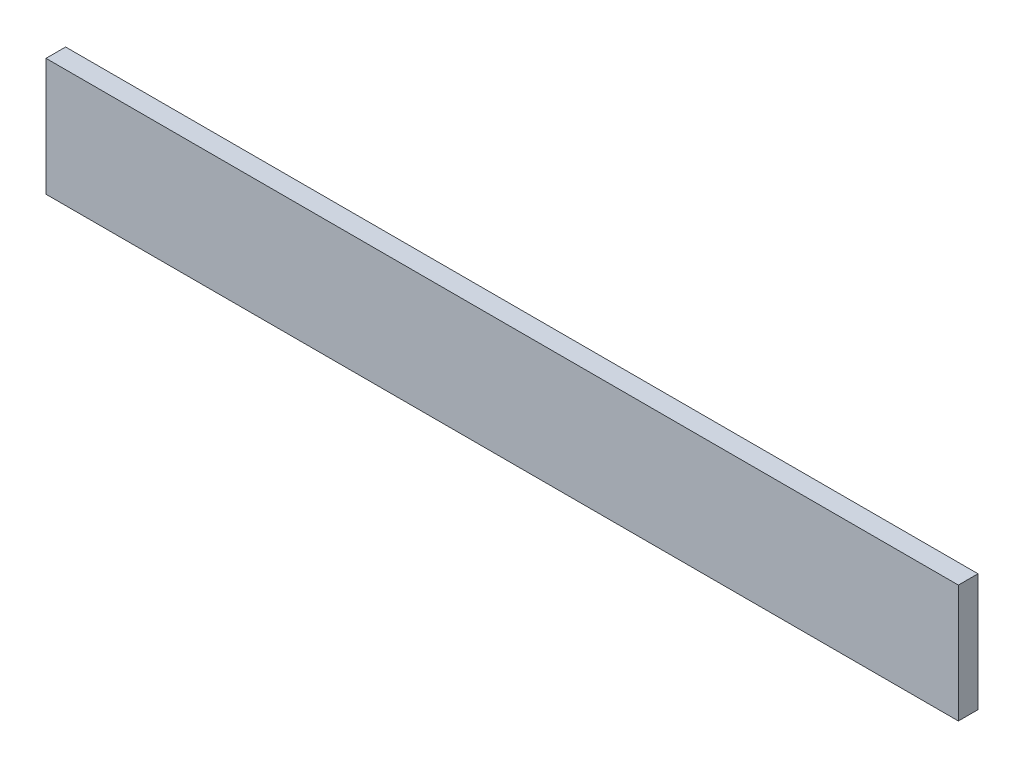
ISO-10303-21;
HEADER;
FILE_DESCRIPTION(('STEP AP214'),'2;1');
FILE_NAME('part.step','',(''),(''),'','','');
FILE_SCHEMA(('AUTOMOTIVE_DESIGN { 1 0 10303 214 1 1 1 1 }'));
ENDSEC;
DATA;
#1=APPLICATION_CONTEXT('core data for automotive mechanical design processes');
#2=APPLICATION_PROTOCOL_DEFINITION('international standard','automotive_design',2000,#1);
#3=PRODUCT_CONTEXT('',#1,'mechanical');
#4=PRODUCT('Part','Part','',(#3));
#5=PRODUCT_RELATED_PRODUCT_CATEGORY('part','',(#4));
#6=PRODUCT_DEFINITION_FORMATION('','',#4);
#7=PRODUCT_DEFINITION_CONTEXT('part definition',#1,'design');
#8=PRODUCT_DEFINITION('design','',#6,#7);
#9=PRODUCT_DEFINITION_SHAPE('','',#8);
#10=(LENGTH_UNIT() NAMED_UNIT(*) SI_UNIT(.MILLI.,.METRE.));
#11=(NAMED_UNIT(*) PLANE_ANGLE_UNIT() SI_UNIT($,.RADIAN.));
#12=(NAMED_UNIT(*) SI_UNIT($,.STERADIAN.) SOLID_ANGLE_UNIT());
#13=UNCERTAINTY_MEASURE_WITH_UNIT(LENGTH_MEASURE(1.E-05),#10,'distance_accuracy_value','');
#14=(GEOMETRIC_REPRESENTATION_CONTEXT(3) GLOBAL_UNCERTAINTY_ASSIGNED_CONTEXT((#13)) GLOBAL_UNIT_ASSIGNED_CONTEXT((#10,
#11,#12)) REPRESENTATION_CONTEXT('',''));
#15=CARTESIAN_POINT('',(0.,0.,0.));
#16=DIRECTION('',(0.,0.,1.));
#17=DIRECTION('',(1.,0.,0.));
#18=AXIS2_PLACEMENT_3D('',#15,#16,#17);
#19=CARTESIAN_POINT('',(-232.5,20.9228381172508,10.));
#20=DIRECTION('',(-1.,0.,0.));
#21=DIRECTION('',(0.,0.,1.));
#22=AXIS2_PLACEMENT_3D('',#19,#20,#21);
#23=PLANE('',#22);
#24=DIRECTION('',(0.,1.,0.));
#25=VECTOR('',#24,1.);
#26=CARTESIAN_POINT('',(-232.5,20.9228381172508,0.));
#27=LINE('',#26,#25);
#28=CARTESIAN_POINT('',(-232.5,20.9228381172508,0.));
#29=VERTEX_POINT('',#28);
#30=CARTESIAN_POINT('',(-232.5,80.9228381172508,0.));
#31=VERTEX_POINT('',#30);
#32=EDGE_CURVE('E97',#29,#31,#27,.T.);
#33=ORIENTED_EDGE('',*,*,#32,.F.);
#34=DIRECTION('',(0.,0.,-1.));
#35=VECTOR('',#34,1.);
#36=CARTESIAN_POINT('',(-232.5,20.9228381172508,10.));
#37=LINE('',#36,#35);
#38=CARTESIAN_POINT('',(-232.5,20.9228381172508,10.));
#39=VERTEX_POINT('',#38);
#40=EDGE_CURVE('E11',#39,#29,#37,.T.);
#41=ORIENTED_EDGE('',*,*,#40,.F.);
#42=DIRECTION('',(0.,1.,0.));
#43=VECTOR('',#42,1.);
#44=CARTESIAN_POINT('',(-232.5,20.9228381172508,10.));
#45=LINE('',#44,#43);
#46=CARTESIAN_POINT('',(-232.5,80.9228381172508,10.));
#47=VERTEX_POINT('',#46);
#48=EDGE_CURVE('E91',#39,#47,#45,.T.);
#49=ORIENTED_EDGE('',*,*,#48,.T.);
#50=DIRECTION('',(0.,0.,-1.));
#51=VECTOR('',#50,1.);
#52=CARTESIAN_POINT('',(-232.5,80.9228381172508,10.));
#53=LINE('',#52,#51);
#54=EDGE_CURVE('E36',#47,#31,#53,.T.);
#55=ORIENTED_EDGE('',*,*,#54,.T.);
#56=EDGE_LOOP('',(#33,#41,#49,#55));
#57=FACE_BOUND('',#56,.T.);
#58=ADVANCED_FACE('F33',(#57),#23,.T.);
#59=CARTESIAN_POINT('',(232.5,20.9228381172509,10.));
#60=DIRECTION('',(0.,-1.,0.));
#61=DIRECTION('',(1.,0.,0.));
#62=AXIS2_PLACEMENT_3D('',#59,#60,#61);
#63=PLANE('',#62);
#64=DIRECTION('',(-1.,0.,0.));
#65=VECTOR('',#64,1.);
#66=CARTESIAN_POINT('',(232.5,20.9228381172509,0.));
#67=LINE('',#66,#65);
#68=CARTESIAN_POINT('',(232.5,20.9228381172509,0.));
#69=VERTEX_POINT('',#68);
#70=EDGE_CURVE('E93',#69,#29,#67,.T.);
#71=ORIENTED_EDGE('',*,*,#70,.F.);
#72=DIRECTION('',(0.,0.,-1.));
#73=VECTOR('',#72,1.);
#74=CARTESIAN_POINT('',(232.5,20.9228381172509,10.));
#75=LINE('',#74,#73);
#76=CARTESIAN_POINT('',(232.5,20.9228381172509,10.));
#77=VERTEX_POINT('',#76);
#78=EDGE_CURVE('E42',#77,#69,#75,.T.);
#79=ORIENTED_EDGE('',*,*,#78,.F.);
#80=DIRECTION('',(-1.,0.,0.));
#81=VECTOR('',#80,1.);
#82=CARTESIAN_POINT('',(232.5,20.9228381172509,10.));
#83=LINE('',#82,#81);
#84=EDGE_CURVE('E88',#77,#39,#83,.T.);
#85=ORIENTED_EDGE('',*,*,#84,.T.);
#86=ORIENTED_EDGE('',*,*,#40,.T.);
#87=EDGE_LOOP('',(#71,#79,#85,#86));
#88=FACE_BOUND('',#87,.T.);
#89=ADVANCED_FACE('F107',(#88),#63,.T.);
#90=CARTESIAN_POINT('',(232.5,80.9228381172508,10.));
#91=DIRECTION('',(1.,0.,0.));
#92=DIRECTION('',(0.,0.,-1.));
#93=AXIS2_PLACEMENT_3D('',#90,#91,#92);
#94=PLANE('',#93);
#95=DIRECTION('',(0.,-1.,0.));
#96=VECTOR('',#95,1.);
#97=CARTESIAN_POINT('',(232.5,80.9228381172508,0.));
#98=LINE('',#97,#96);
#99=CARTESIAN_POINT('',(232.5,80.9228381172508,0.));
#100=VERTEX_POINT('',#99);
#101=EDGE_CURVE('E83',#100,#69,#98,.T.);
#102=ORIENTED_EDGE('',*,*,#101,.F.);
#103=DIRECTION('',(0.,0.,-1.));
#104=VECTOR('',#103,1.);
#105=CARTESIAN_POINT('',(232.5,80.9228381172508,10.));
#106=LINE('',#105,#104);
#107=CARTESIAN_POINT('',(232.5,80.9228381172508,10.));
#108=VERTEX_POINT('',#107);
#109=EDGE_CURVE('E78',#108,#100,#106,.T.);
#110=ORIENTED_EDGE('',*,*,#109,.F.);
#111=DIRECTION('',(0.,-1.,0.));
#112=VECTOR('',#111,1.);
#113=CARTESIAN_POINT('',(232.5,80.9228381172508,10.));
#114=LINE('',#113,#112);
#115=EDGE_CURVE('E81',#108,#77,#114,.T.);
#116=ORIENTED_EDGE('',*,*,#115,.T.);
#117=ORIENTED_EDGE('',*,*,#78,.T.);
#118=EDGE_LOOP('',(#102,#110,#116,#117));
#119=FACE_BOUND('',#118,.T.);
#120=ADVANCED_FACE('F80',(#119),#94,.T.);
#121=CARTESIAN_POINT('',(-232.5,80.9228381172508,10.));
#122=DIRECTION('',(0.,1.,0.));
#123=DIRECTION('',(0.,0.,1.));
#124=AXIS2_PLACEMENT_3D('',#121,#122,#123);
#125=PLANE('',#124);
#126=DIRECTION('',(1.,0.,0.));
#127=VECTOR('',#126,1.);
#128=CARTESIAN_POINT('',(-232.5,80.9228381172508,0.));
#129=LINE('',#128,#127);
#130=EDGE_CURVE('E100',#31,#100,#129,.T.);
#131=ORIENTED_EDGE('',*,*,#130,.F.);
#132=ORIENTED_EDGE('',*,*,#54,.F.);
#133=DIRECTION('',(1.,0.,0.));
#134=VECTOR('',#133,1.);
#135=CARTESIAN_POINT('',(-232.5,80.9228381172508,10.));
#136=LINE('',#135,#134);
#137=EDGE_CURVE('E87',#47,#108,#136,.T.);
#138=ORIENTED_EDGE('',*,*,#137,.T.);
#139=ORIENTED_EDGE('',*,*,#109,.T.);
#140=EDGE_LOOP('',(#131,#132,#138,#139));
#141=FACE_BOUND('',#140,.T.);
#142=ADVANCED_FACE('F90',(#141),#125,.T.);
#143=CARTESIAN_POINT('',(0.,0.,10.));
#144=DIRECTION('',(0.,0.,-1.));
#145=DIRECTION('',(-1.,0.,0.));
#146=AXIS2_PLACEMENT_3D('',#143,#144,#145);
#147=PLANE('',#146);
#148=ORIENTED_EDGE('',*,*,#48,.F.);
#149=ORIENTED_EDGE('',*,*,#84,.F.);
#150=ORIENTED_EDGE('',*,*,#115,.F.);
#151=ORIENTED_EDGE('',*,*,#137,.F.);
#152=EDGE_LOOP('',(#148,#149,#150,#151));
#153=FACE_BOUND('',#152,.T.);
#154=ADVANCED_FACE('F86',(#153),#147,.F.);
#155=CARTESIAN_POINT('',(0.,0.,0.));
#156=DIRECTION('',(0.,0.,-1.));
#157=DIRECTION('',(-1.,0.,0.));
#158=AXIS2_PLACEMENT_3D('',#155,#156,#157);
#159=PLANE('',#158);
#160=ORIENTED_EDGE('',*,*,#32,.T.);
#161=ORIENTED_EDGE('',*,*,#130,.T.);
#162=ORIENTED_EDGE('',*,*,#101,.T.);
#163=ORIENTED_EDGE('',*,*,#70,.T.);
#164=EDGE_LOOP('',(#160,#161,#162,#163));
#165=FACE_BOUND('',#164,.T.);
#166=ADVANCED_FACE('F106',(#165),#159,.T.);
#167=CLOSED_SHELL('',(#58,#89,#120,#142,#154,#166));
#168=MANIFOLD_SOLID_BREP('B2',#167);
#169=ADVANCED_BREP_SHAPE_REPRESENTATION('',(#18,#168),#14);
#170=SHAPE_DEFINITION_REPRESENTATION(#9,#169);
ENDSEC;
END-ISO-10303-21;
